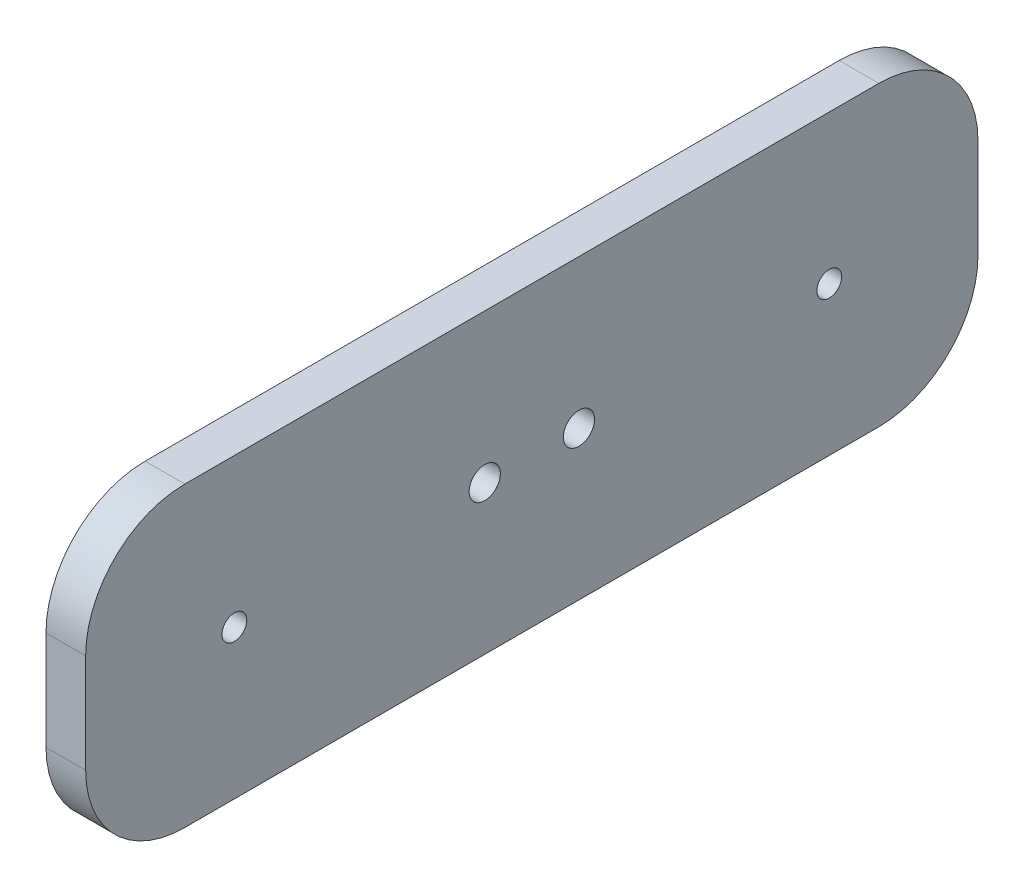
ISO-10303-21;
HEADER;
FILE_DESCRIPTION(('STEP AP214'),'2;1');
FILE_NAME('part.step','',(''),(''),'','','');
FILE_SCHEMA(('AUTOMOTIVE_DESIGN { 1 0 10303 214 1 1 1 1 }'));
ENDSEC;
DATA;
#1=APPLICATION_CONTEXT('core data for automotive mechanical design processes');
#2=APPLICATION_PROTOCOL_DEFINITION('international standard','automotive_design',2000,#1);
#3=PRODUCT_CONTEXT('',#1,'mechanical');
#4=PRODUCT('Part','Part','',(#3));
#5=PRODUCT_RELATED_PRODUCT_CATEGORY('part','',(#4));
#6=PRODUCT_DEFINITION_FORMATION('','',#4);
#7=PRODUCT_DEFINITION_CONTEXT('part definition',#1,'design');
#8=PRODUCT_DEFINITION('design','',#6,#7);
#9=PRODUCT_DEFINITION_SHAPE('','',#8);
#10=(LENGTH_UNIT() NAMED_UNIT(*) SI_UNIT(.MILLI.,.METRE.));
#11=(NAMED_UNIT(*) PLANE_ANGLE_UNIT() SI_UNIT($,.RADIAN.));
#12=(NAMED_UNIT(*) SI_UNIT($,.STERADIAN.) SOLID_ANGLE_UNIT());
#13=UNCERTAINTY_MEASURE_WITH_UNIT(LENGTH_MEASURE(1.E-05),#10,'distance_accuracy_value','');
#14=(GEOMETRIC_REPRESENTATION_CONTEXT(3) GLOBAL_UNCERTAINTY_ASSIGNED_CONTEXT((#13)) GLOBAL_UNIT_ASSIGNED_CONTEXT((#10,
#11,#12)) REPRESENTATION_CONTEXT('',''));
#15=CARTESIAN_POINT('',(0.,0.,0.));
#16=DIRECTION('',(0.,0.,1.));
#17=DIRECTION('',(1.,0.,0.));
#18=AXIS2_PLACEMENT_3D('',#15,#16,#17);
#19=CARTESIAN_POINT('',(4.,-15.,-45.));
#20=DIRECTION('',(0.,0.,1.));
#21=DIRECTION('',(1.,0.,0.));
#22=AXIS2_PLACEMENT_3D('',#19,#20,#21);
#23=PLANE('',#22);
#24=DIRECTION('',(0.,1.,0.));
#25=VECTOR('',#24,1.);
#26=CARTESIAN_POINT('',(0.,-15.,-45.));
#27=LINE('',#26,#25);
#28=CARTESIAN_POINT('',(0.,-5.,-45.));
#29=VERTEX_POINT('',#28);
#30=CARTESIAN_POINT('',(0.,5.,-45.));
#31=VERTEX_POINT('',#30);
#32=EDGE_CURVE('E128',#29,#31,#27,.T.);
#33=ORIENTED_EDGE('',*,*,#32,.T.);
#34=DIRECTION('',(-1.,0.,0.));
#35=VECTOR('',#34,1.);
#36=CARTESIAN_POINT('',(4.,5.,-45.));
#37=LINE('',#36,#35);
#38=CARTESIAN_POINT('',(4.,5.,-45.));
#39=VERTEX_POINT('',#38);
#40=EDGE_CURVE('E11',#31,#39,#37,.F.);
#41=ORIENTED_EDGE('',*,*,#40,.T.);
#42=DIRECTION('',(0.,1.,0.));
#43=VECTOR('',#42,1.);
#44=CARTESIAN_POINT('',(4.,-15.,-45.));
#45=LINE('',#44,#43);
#46=CARTESIAN_POINT('',(4.,-5.,-45.));
#47=VERTEX_POINT('',#46);
#48=EDGE_CURVE('E126',#47,#39,#45,.T.);
#49=ORIENTED_EDGE('',*,*,#48,.F.);
#50=DIRECTION('',(-1.,0.,0.));
#51=VECTOR('',#50,1.);
#52=CARTESIAN_POINT('',(4.,-5.,-45.));
#53=LINE('',#52,#51);
#54=EDGE_CURVE('E40',#47,#29,#53,.T.);
#55=ORIENTED_EDGE('',*,*,#54,.T.);
#56=EDGE_LOOP('',(#33,#41,#49,#55));
#57=FACE_BOUND('',#56,.T.);
#58=ADVANCED_FACE('F32',(#57),#23,.F.);
#59=CARTESIAN_POINT('',(4.,15.,45.));
#60=DIRECTION('',(0.,-1.,0.));
#61=DIRECTION('',(0.,0.,-1.));
#62=AXIS2_PLACEMENT_3D('',#59,#60,#61);
#63=PLANE('',#62);
#64=DIRECTION('',(0.,0.,1.));
#65=VECTOR('',#64,1.);
#66=CARTESIAN_POINT('',(0.,15.,45.));
#67=LINE('',#66,#65);
#68=CARTESIAN_POINT('',(0.,15.,-35.));
#69=VERTEX_POINT('',#68);
#70=CARTESIAN_POINT('',(0.,15.,35.));
#71=VERTEX_POINT('',#70);
#72=EDGE_CURVE('E124',#69,#71,#67,.T.);
#73=ORIENTED_EDGE('',*,*,#72,.T.);
#74=DIRECTION('',(-1.,0.,0.));
#75=VECTOR('',#74,1.);
#76=CARTESIAN_POINT('',(4.,15.,35.));
#77=LINE('',#76,#75);
#78=CARTESIAN_POINT('',(4.,15.,35.));
#79=VERTEX_POINT('',#78);
#80=EDGE_CURVE('E103',#71,#79,#77,.F.);
#81=ORIENTED_EDGE('',*,*,#80,.T.);
#82=DIRECTION('',(0.,0.,1.));
#83=VECTOR('',#82,1.);
#84=CARTESIAN_POINT('',(4.,15.,45.));
#85=LINE('',#84,#83);
#86=CARTESIAN_POINT('',(4.,15.,-35.));
#87=VERTEX_POINT('',#86);
#88=EDGE_CURVE('E168',#87,#79,#85,.T.);
#89=ORIENTED_EDGE('',*,*,#88,.F.);
#90=DIRECTION('',(-1.,0.,0.));
#91=VECTOR('',#90,1.);
#92=CARTESIAN_POINT('',(4.,15.,-35.));
#93=LINE('',#92,#91);
#94=EDGE_CURVE('E108',#87,#69,#93,.T.);
#95=ORIENTED_EDGE('',*,*,#94,.T.);
#96=EDGE_LOOP('',(#73,#81,#89,#95));
#97=FACE_BOUND('',#96,.T.);
#98=ADVANCED_FACE('F216',(#97),#63,.F.);
#99=CARTESIAN_POINT('',(4.,-15.,45.));
#100=DIRECTION('',(0.,0.,-1.));
#101=DIRECTION('',(-1.,0.,0.));
#102=AXIS2_PLACEMENT_3D('',#99,#100,#101);
#103=PLANE('',#102);
#104=DIRECTION('',(0.,-1.,0.));
#105=VECTOR('',#104,1.);
#106=CARTESIAN_POINT('',(4.,-15.,45.));
#107=LINE('',#106,#105);
#108=CARTESIAN_POINT('',(4.,5.,45.));
#109=VERTEX_POINT('',#108);
#110=CARTESIAN_POINT('',(4.,-5.,45.));
#111=VERTEX_POINT('',#110);
#112=EDGE_CURVE('E117',#109,#111,#107,.T.);
#113=ORIENTED_EDGE('',*,*,#112,.F.);
#114=DIRECTION('',(-1.,0.,0.));
#115=VECTOR('',#114,1.);
#116=CARTESIAN_POINT('',(4.,5.,45.));
#117=LINE('',#116,#115);
#118=CARTESIAN_POINT('',(0.,5.,45.));
#119=VERTEX_POINT('',#118);
#120=EDGE_CURVE('E102',#109,#119,#117,.T.);
#121=ORIENTED_EDGE('',*,*,#120,.T.);
#122=DIRECTION('',(0.,-1.,0.));
#123=VECTOR('',#122,1.);
#124=CARTESIAN_POINT('',(0.,-15.,45.));
#125=LINE('',#124,#123);
#126=CARTESIAN_POINT('',(0.,-5.,45.));
#127=VERTEX_POINT('',#126);
#128=EDGE_CURVE('E115',#119,#127,#125,.T.);
#129=ORIENTED_EDGE('',*,*,#128,.T.);
#130=DIRECTION('',(-1.,0.,0.));
#131=VECTOR('',#130,1.);
#132=CARTESIAN_POINT('',(4.,-5.,45.));
#133=LINE('',#132,#131);
#134=EDGE_CURVE('E119',#127,#111,#133,.F.);
#135=ORIENTED_EDGE('',*,*,#134,.T.);
#136=EDGE_LOOP('',(#113,#121,#129,#135));
#137=FACE_BOUND('',#136,.T.);
#138=ADVANCED_FACE('F114',(#137),#103,.F.);
#139=CARTESIAN_POINT('',(4.,-15.,45.));
#140=DIRECTION('',(0.,1.,0.));
#141=DIRECTION('',(0.,0.,1.));
#142=AXIS2_PLACEMENT_3D('',#139,#140,#141);
#143=PLANE('',#142);
#144=DIRECTION('',(0.,0.,-1.));
#145=VECTOR('',#144,1.);
#146=CARTESIAN_POINT('',(4.,-15.,45.));
#147=LINE('',#146,#145);
#148=CARTESIAN_POINT('',(4.,-15.,35.));
#149=VERTEX_POINT('',#148);
#150=CARTESIAN_POINT('',(4.,-15.,-35.));
#151=VERTEX_POINT('',#150);
#152=EDGE_CURVE('E132',#149,#151,#147,.T.);
#153=ORIENTED_EDGE('',*,*,#152,.F.);
#154=DIRECTION('',(-1.,0.,0.));
#155=VECTOR('',#154,1.);
#156=CARTESIAN_POINT('',(4.,-15.,35.));
#157=LINE('',#156,#155);
#158=CARTESIAN_POINT('',(0.,-15.,35.));
#159=VERTEX_POINT('',#158);
#160=EDGE_CURVE('E149',#149,#159,#157,.T.);
#161=ORIENTED_EDGE('',*,*,#160,.T.);
#162=DIRECTION('',(0.,0.,-1.));
#163=VECTOR('',#162,1.);
#164=CARTESIAN_POINT('',(0.,-15.,45.));
#165=LINE('',#164,#163);
#166=CARTESIAN_POINT('',(0.,-15.,-35.));
#167=VERTEX_POINT('',#166);
#168=EDGE_CURVE('E123',#159,#167,#165,.T.);
#169=ORIENTED_EDGE('',*,*,#168,.T.);
#170=DIRECTION('',(-1.,0.,0.));
#171=VECTOR('',#170,1.);
#172=CARTESIAN_POINT('',(4.,-15.,-35.));
#173=LINE('',#172,#171);
#174=EDGE_CURVE('E47',#167,#151,#173,.F.);
#175=ORIENTED_EDGE('',*,*,#174,.T.);
#176=EDGE_LOOP('',(#153,#161,#169,#175));
#177=FACE_BOUND('',#176,.T.);
#178=ADVANCED_FACE('F205',(#177),#143,.F.);
#179=CARTESIAN_POINT('',(4.,0.,0.));
#180=DIRECTION('',(-1.,0.,0.));
#181=DIRECTION('',(0.,0.,1.));
#182=AXIS2_PLACEMENT_3D('',#179,#180,#181);
#183=PLANE('',#182);
#184=CARTESIAN_POINT('',(4.,0.,-30.));
#185=DIRECTION('',(1.,0.,0.));
#186=DIRECTION('',(0.,0.,-1.));
#187=AXIS2_PLACEMENT_3D('',#184,#185,#186);
#188=CIRCLE('',#187,1.25000000000001);
#189=CARTESIAN_POINT('',(4.,0.,-31.25));
#190=VERTEX_POINT('',#189);
#191=EDGE_CURVE('E187',#190,#190,#188,.T.);
#192=ORIENTED_EDGE('',*,*,#191,.F.);
#193=EDGE_LOOP('',(#192));
#194=FACE_BOUND('',#193,.T.);
#195=CARTESIAN_POINT('',(4.,0.,30.));
#196=DIRECTION('',(1.,0.,0.));
#197=DIRECTION('',(0.,0.,-1.));
#198=AXIS2_PLACEMENT_3D('',#195,#196,#197);
#199=CIRCLE('',#198,1.25);
#200=CARTESIAN_POINT('',(4.,0.,28.75));
#201=VERTEX_POINT('',#200);
#202=EDGE_CURVE('E181',#201,#201,#199,.T.);
#203=ORIENTED_EDGE('',*,*,#202,.F.);
#204=EDGE_LOOP('',(#203));
#205=FACE_BOUND('',#204,.T.);
#206=CARTESIAN_POINT('',(4.,0.,-4.75));
#207=DIRECTION('',(1.,0.,0.));
#208=DIRECTION('',(0.,0.,-1.));
#209=AXIS2_PLACEMENT_3D('',#206,#207,#208);
#210=CIRCLE('',#209,1.575);
#211=CARTESIAN_POINT('',(4.,0.,-6.325));
#212=VERTEX_POINT('',#211);
#213=EDGE_CURVE('E175',#212,#212,#210,.T.);
#214=ORIENTED_EDGE('',*,*,#213,.F.);
#215=EDGE_LOOP('',(#214));
#216=FACE_BOUND('',#215,.T.);
#217=CARTESIAN_POINT('',(4.,0.,4.75));
#218=DIRECTION('',(1.,0.,0.));
#219=DIRECTION('',(0.,0.,-1.));
#220=AXIS2_PLACEMENT_3D('',#217,#218,#219);
#221=CIRCLE('',#220,1.575);
#222=CARTESIAN_POINT('',(4.,0.,3.175));
#223=VERTEX_POINT('',#222);
#224=EDGE_CURVE('E163',#223,#223,#221,.T.);
#225=ORIENTED_EDGE('',*,*,#224,.F.);
#226=EDGE_LOOP('',(#225));
#227=FACE_BOUND('',#226,.T.);
#228=ORIENTED_EDGE('',*,*,#88,.T.);
#229=CARTESIAN_POINT('',(4.,5.,35.));
#230=DIRECTION('',(-1.,0.,0.));
#231=DIRECTION('',(0.,0.,1.));
#232=AXIS2_PLACEMENT_3D('',#229,#230,#231);
#233=CIRCLE('',#232,10.);
#234=EDGE_CURVE('E146',#79,#109,#233,.F.);
#235=ORIENTED_EDGE('',*,*,#234,.T.);
#236=ORIENTED_EDGE('',*,*,#112,.T.);
#237=CARTESIAN_POINT('',(4.,-5.,35.));
#238=DIRECTION('',(-1.,0.,0.));
#239=DIRECTION('',(0.,0.,1.));
#240=AXIS2_PLACEMENT_3D('',#237,#238,#239);
#241=CIRCLE('',#240,10.);
#242=EDGE_CURVE('E54',#111,#149,#241,.F.);
#243=ORIENTED_EDGE('',*,*,#242,.T.);
#244=ORIENTED_EDGE('',*,*,#152,.T.);
#245=CARTESIAN_POINT('',(4.,-5.,-35.));
#246=DIRECTION('',(-1.,0.,0.));
#247=DIRECTION('',(0.,0.,1.));
#248=AXIS2_PLACEMENT_3D('',#245,#246,#247);
#249=CIRCLE('',#248,10.);
#250=EDGE_CURVE('E141',#151,#47,#249,.F.);
#251=ORIENTED_EDGE('',*,*,#250,.T.);
#252=ORIENTED_EDGE('',*,*,#48,.T.);
#253=CARTESIAN_POINT('',(4.,5.,-35.));
#254=DIRECTION('',(-1.,0.,0.));
#255=DIRECTION('',(0.,0.,1.));
#256=AXIS2_PLACEMENT_3D('',#253,#254,#255);
#257=CIRCLE('',#256,10.);
#258=EDGE_CURVE('E143',#39,#87,#257,.F.);
#259=ORIENTED_EDGE('',*,*,#258,.T.);
#260=EDGE_LOOP('',(#228,#235,#236,#243,#244,#251,#252,#259));
#261=FACE_BOUND('',#260,.T.);
#262=ADVANCED_FACE('F202',(#194,#205,#216,#227,#261),#183,.F.);
#263=CARTESIAN_POINT('',(0.,0.,0.));
#264=DIRECTION('',(-1.,0.,0.));
#265=DIRECTION('',(0.,0.,1.));
#266=AXIS2_PLACEMENT_3D('',#263,#264,#265);
#267=PLANE('',#266);
#268=CARTESIAN_POINT('',(0.,0.,-30.));
#269=DIRECTION('',(1.,0.,0.));
#270=DIRECTION('',(0.,0.,-1.));
#271=AXIS2_PLACEMENT_3D('',#268,#269,#270);
#272=CIRCLE('',#271,1.25000000000001);
#273=CARTESIAN_POINT('',(0.,0.,-31.25));
#274=VERTEX_POINT('',#273);
#275=EDGE_CURVE('E184',#274,#274,#272,.T.);
#276=ORIENTED_EDGE('',*,*,#275,.T.);
#277=EDGE_LOOP('',(#276));
#278=FACE_BOUND('',#277,.T.);
#279=CARTESIAN_POINT('',(0.,0.,30.));
#280=DIRECTION('',(1.,0.,0.));
#281=DIRECTION('',(0.,0.,-1.));
#282=AXIS2_PLACEMENT_3D('',#279,#280,#281);
#283=CIRCLE('',#282,1.25);
#284=CARTESIAN_POINT('',(0.,0.,28.75));
#285=VERTEX_POINT('',#284);
#286=EDGE_CURVE('E178',#285,#285,#283,.T.);
#287=ORIENTED_EDGE('',*,*,#286,.T.);
#288=EDGE_LOOP('',(#287));
#289=FACE_BOUND('',#288,.T.);
#290=CARTESIAN_POINT('',(0.,0.,-4.75));
#291=DIRECTION('',(1.,0.,0.));
#292=DIRECTION('',(0.,0.,-1.));
#293=AXIS2_PLACEMENT_3D('',#290,#291,#292);
#294=CIRCLE('',#293,1.575);
#295=CARTESIAN_POINT('',(0.,0.,-6.325));
#296=VERTEX_POINT('',#295);
#297=EDGE_CURVE('E173',#296,#296,#294,.T.);
#298=ORIENTED_EDGE('',*,*,#297,.T.);
#299=EDGE_LOOP('',(#298));
#300=FACE_BOUND('',#299,.T.);
#301=CARTESIAN_POINT('',(0.,0.,4.75));
#302=DIRECTION('',(1.,0.,0.));
#303=DIRECTION('',(0.,0.,-1.));
#304=AXIS2_PLACEMENT_3D('',#301,#302,#303);
#305=CIRCLE('',#304,1.575);
#306=CARTESIAN_POINT('',(0.,0.,3.175));
#307=VERTEX_POINT('',#306);
#308=EDGE_CURVE('E161',#307,#307,#305,.T.);
#309=ORIENTED_EDGE('',*,*,#308,.T.);
#310=EDGE_LOOP('',(#309));
#311=FACE_BOUND('',#310,.T.);
#312=ORIENTED_EDGE('',*,*,#128,.F.);
#313=CARTESIAN_POINT('',(0.,5.,35.));
#314=DIRECTION('',(-1.,0.,0.));
#315=DIRECTION('',(0.,0.,1.));
#316=AXIS2_PLACEMENT_3D('',#313,#314,#315);
#317=CIRCLE('',#316,10.);
#318=EDGE_CURVE('E98',#119,#71,#317,.T.);
#319=ORIENTED_EDGE('',*,*,#318,.T.);
#320=ORIENTED_EDGE('',*,*,#72,.F.);
#321=CARTESIAN_POINT('',(0.,5.,-35.));
#322=DIRECTION('',(-1.,0.,0.));
#323=DIRECTION('',(0.,0.,1.));
#324=AXIS2_PLACEMENT_3D('',#321,#322,#323);
#325=CIRCLE('',#324,10.);
#326=EDGE_CURVE('E135',#69,#31,#325,.T.);
#327=ORIENTED_EDGE('',*,*,#326,.T.);
#328=ORIENTED_EDGE('',*,*,#32,.F.);
#329=CARTESIAN_POINT('',(0.,-5.,-35.));
#330=DIRECTION('',(-1.,0.,0.));
#331=DIRECTION('',(0.,0.,1.));
#332=AXIS2_PLACEMENT_3D('',#329,#330,#331);
#333=CIRCLE('',#332,10.);
#334=EDGE_CURVE('E118',#29,#167,#333,.T.);
#335=ORIENTED_EDGE('',*,*,#334,.T.);
#336=ORIENTED_EDGE('',*,*,#168,.F.);
#337=CARTESIAN_POINT('',(0.,-5.,35.));
#338=DIRECTION('',(-1.,0.,0.));
#339=DIRECTION('',(0.,0.,1.));
#340=AXIS2_PLACEMENT_3D('',#337,#338,#339);
#341=CIRCLE('',#340,10.);
#342=EDGE_CURVE('E109',#159,#127,#341,.T.);
#343=ORIENTED_EDGE('',*,*,#342,.T.);
#344=EDGE_LOOP('',(#312,#319,#320,#327,#328,#335,#336,#343));
#345=FACE_BOUND('',#344,.T.);
#346=ADVANCED_FACE('F121',(#278,#289,#300,#311,#345),#267,.T.);
#347=CARTESIAN_POINT('',(0.,0.,4.75));
#348=DIRECTION('',(1.,0.,0.));
#349=DIRECTION('',(0.,0.,-1.));
#350=AXIS2_PLACEMENT_3D('',#347,#348,#349);
#351=CYLINDRICAL_SURFACE('',#350,1.575);
#352=ORIENTED_EDGE('',*,*,#308,.F.);
#353=EDGE_LOOP('',(#352));
#354=FACE_BOUND('',#353,.T.);
#355=ORIENTED_EDGE('',*,*,#224,.T.);
#356=EDGE_LOOP('',(#355));
#357=FACE_BOUND('',#356,.T.);
#358=ADVANCED_FACE('F246',(#354,#357),#351,.F.);
#359=CARTESIAN_POINT('',(0.,0.,-4.75));
#360=DIRECTION('',(1.,0.,0.));
#361=DIRECTION('',(0.,0.,-1.));
#362=AXIS2_PLACEMENT_3D('',#359,#360,#361);
#363=CYLINDRICAL_SURFACE('',#362,1.575);
#364=ORIENTED_EDGE('',*,*,#297,.F.);
#365=EDGE_LOOP('',(#364));
#366=FACE_BOUND('',#365,.T.);
#367=ORIENTED_EDGE('',*,*,#213,.T.);
#368=EDGE_LOOP('',(#367));
#369=FACE_BOUND('',#368,.T.);
#370=ADVANCED_FACE('F250',(#366,#369),#363,.F.);
#371=CARTESIAN_POINT('',(0.,0.,30.));
#372=DIRECTION('',(1.,0.,0.));
#373=DIRECTION('',(0.,0.,-1.));
#374=AXIS2_PLACEMENT_3D('',#371,#372,#373);
#375=CYLINDRICAL_SURFACE('',#374,1.25);
#376=ORIENTED_EDGE('',*,*,#286,.F.);
#377=EDGE_LOOP('',(#376));
#378=FACE_BOUND('',#377,.T.);
#379=ORIENTED_EDGE('',*,*,#202,.T.);
#380=EDGE_LOOP('',(#379));
#381=FACE_BOUND('',#380,.T.);
#382=ADVANCED_FACE('F198',(#378,#381),#375,.F.);
#383=CARTESIAN_POINT('',(0.,0.,-30.));
#384=DIRECTION('',(1.,0.,0.));
#385=DIRECTION('',(0.,0.,-1.));
#386=AXIS2_PLACEMENT_3D('',#383,#384,#385);
#387=CYLINDRICAL_SURFACE('',#386,1.25000000000001);
#388=ORIENTED_EDGE('',*,*,#275,.F.);
#389=EDGE_LOOP('',(#388));
#390=FACE_BOUND('',#389,.T.);
#391=ORIENTED_EDGE('',*,*,#191,.T.);
#392=EDGE_LOOP('',(#391));
#393=FACE_BOUND('',#392,.T.);
#394=ADVANCED_FACE('F195',(#390,#393),#387,.F.);
#395=CARTESIAN_POINT('',(4.,5.,35.));
#396=DIRECTION('',(-1.,0.,0.));
#397=DIRECTION('',(0.,0.,1.));
#398=AXIS2_PLACEMENT_3D('',#395,#396,#397);
#399=CYLINDRICAL_SURFACE('',#398,10.);
#400=ORIENTED_EDGE('',*,*,#234,.F.);
#401=ORIENTED_EDGE('',*,*,#80,.F.);
#402=ORIENTED_EDGE('',*,*,#318,.F.);
#403=ORIENTED_EDGE('',*,*,#120,.F.);
#404=EDGE_LOOP('',(#400,#401,#402,#403));
#405=FACE_BOUND('',#404,.T.);
#406=ADVANCED_FACE('F101',(#405),#399,.T.);
#407=CARTESIAN_POINT('',(4.,-5.,35.));
#408=DIRECTION('',(-1.,0.,0.));
#409=DIRECTION('',(0.,0.,1.));
#410=AXIS2_PLACEMENT_3D('',#407,#408,#409);
#411=CYLINDRICAL_SURFACE('',#410,10.);
#412=ORIENTED_EDGE('',*,*,#242,.F.);
#413=ORIENTED_EDGE('',*,*,#134,.F.);
#414=ORIENTED_EDGE('',*,*,#342,.F.);
#415=ORIENTED_EDGE('',*,*,#160,.F.);
#416=EDGE_LOOP('',(#412,#413,#414,#415));
#417=FACE_BOUND('',#416,.T.);
#418=ADVANCED_FACE('F223',(#417),#411,.T.);
#419=CARTESIAN_POINT('',(4.,5.,-35.));
#420=DIRECTION('',(-1.,0.,0.));
#421=DIRECTION('',(0.,0.,1.));
#422=AXIS2_PLACEMENT_3D('',#419,#420,#421);
#423=CYLINDRICAL_SURFACE('',#422,10.);
#424=ORIENTED_EDGE('',*,*,#258,.F.);
#425=ORIENTED_EDGE('',*,*,#40,.F.);
#426=ORIENTED_EDGE('',*,*,#326,.F.);
#427=ORIENTED_EDGE('',*,*,#94,.F.);
#428=EDGE_LOOP('',(#424,#425,#426,#427));
#429=FACE_BOUND('',#428,.T.);
#430=ADVANCED_FACE('F218',(#429),#423,.T.);
#431=CARTESIAN_POINT('',(4.,-5.,-35.));
#432=DIRECTION('',(-1.,0.,0.));
#433=DIRECTION('',(0.,0.,1.));
#434=AXIS2_PLACEMENT_3D('',#431,#432,#433);
#435=CYLINDRICAL_SURFACE('',#434,10.);
#436=ORIENTED_EDGE('',*,*,#250,.F.);
#437=ORIENTED_EDGE('',*,*,#174,.F.);
#438=ORIENTED_EDGE('',*,*,#334,.F.);
#439=ORIENTED_EDGE('',*,*,#54,.F.);
#440=EDGE_LOOP('',(#436,#437,#438,#439));
#441=FACE_BOUND('',#440,.T.);
#442=ADVANCED_FACE('F34',(#441),#435,.T.);
#443=CLOSED_SHELL('',(#58,#98,#138,#178,#262,#346,#358,#370,#382,#394,#406,#418,#430,#442));
#444=MANIFOLD_SOLID_BREP('B2',#443);
#445=ADVANCED_BREP_SHAPE_REPRESENTATION('',(#18,#444),#14);
#446=SHAPE_DEFINITION_REPRESENTATION(#9,#445);
ENDSEC;
END-ISO-10303-21;
